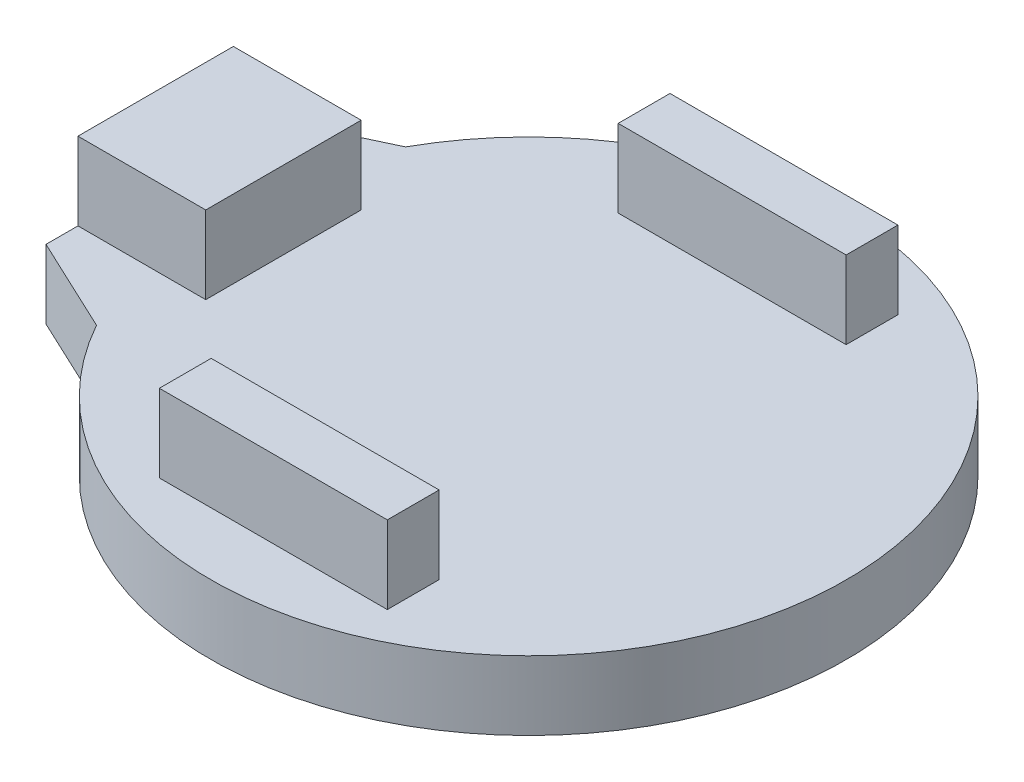
ISO-10303-21;
HEADER;
FILE_DESCRIPTION(('STEP AP214'),'2;1');
FILE_NAME('part.step','',(''),(''),'','','');
FILE_SCHEMA(('AUTOMOTIVE_DESIGN { 1 0 10303 214 1 1 1 1 }'));
ENDSEC;
DATA;
#1=APPLICATION_CONTEXT('core data for automotive mechanical design processes');
#2=APPLICATION_PROTOCOL_DEFINITION('international standard','automotive_design',2000,#1);
#3=PRODUCT_CONTEXT('',#1,'mechanical');
#4=PRODUCT('Part','Part','',(#3));
#5=PRODUCT_RELATED_PRODUCT_CATEGORY('part','',(#4));
#6=PRODUCT_DEFINITION_FORMATION('','',#4);
#7=PRODUCT_DEFINITION_CONTEXT('part definition',#1,'design');
#8=PRODUCT_DEFINITION('design','',#6,#7);
#9=PRODUCT_DEFINITION_SHAPE('','',#8);
#10=(LENGTH_UNIT() NAMED_UNIT(*) SI_UNIT(.MILLI.,.METRE.));
#11=(NAMED_UNIT(*) PLANE_ANGLE_UNIT() SI_UNIT($,.RADIAN.));
#12=(NAMED_UNIT(*) SI_UNIT($,.STERADIAN.) SOLID_ANGLE_UNIT());
#13=UNCERTAINTY_MEASURE_WITH_UNIT(LENGTH_MEASURE(1.E-05),#10,'distance_accuracy_value','');
#14=(GEOMETRIC_REPRESENTATION_CONTEXT(3) GLOBAL_UNCERTAINTY_ASSIGNED_CONTEXT((#13)) GLOBAL_UNIT_ASSIGNED_CONTEXT((#10,
#11,#12)) REPRESENTATION_CONTEXT('',''));
#15=CARTESIAN_POINT('',(0.,0.,0.));
#16=DIRECTION('',(0.,0.,1.));
#17=DIRECTION('',(1.,0.,0.));
#18=AXIS2_PLACEMENT_3D('',#15,#16,#17);
#19=CARTESIAN_POINT('',(0.,4.,0.));
#20=DIRECTION('',(0.,1.,0.));
#21=DIRECTION('',(0.,0.,1.));
#22=AXIS2_PLACEMENT_3D('',#19,#20,#21);
#23=PLANE('',#22);
#24=DIRECTION('',(-1.,0.,0.));
#25=VECTOR('',#24,1.);
#26=CARTESIAN_POINT('',(-6.6,4.,-14.785));
#27=LINE('',#26,#25);
#28=CARTESIAN_POINT('',(6.6,4.,-14.785));
#29=VERTEX_POINT('',#28);
#30=CARTESIAN_POINT('',(-6.6,4.,-14.785));
#31=VERTEX_POINT('',#30);
#32=EDGE_CURVE('E215',#29,#31,#27,.T.);
#33=ORIENTED_EDGE('',*,*,#32,.F.);
#34=DIRECTION('',(0.,0.,-1.));
#35=VECTOR('',#34,1.);
#36=CARTESIAN_POINT('',(6.6,4.,-14.785));
#37=LINE('',#36,#35);
#38=CARTESIAN_POINT('',(6.6,4.,-11.785));
#39=VERTEX_POINT('',#38);
#40=EDGE_CURVE('E201',#39,#29,#37,.T.);
#41=ORIENTED_EDGE('',*,*,#40,.F.);
#42=DIRECTION('',(1.,0.,0.));
#43=VECTOR('',#42,1.);
#44=CARTESIAN_POINT('',(-6.6,4.,-11.785));
#45=LINE('',#44,#43);
#46=CARTESIAN_POINT('',(-6.6,4.,-11.785));
#47=VERTEX_POINT('',#46);
#48=EDGE_CURVE('E206',#47,#39,#45,.T.);
#49=ORIENTED_EDGE('',*,*,#48,.F.);
#50=DIRECTION('',(0.,0.,1.));
#51=VECTOR('',#50,1.);
#52=CARTESIAN_POINT('',(-6.6,4.,-14.785));
#53=LINE('',#52,#51);
#54=EDGE_CURVE('E217',#31,#47,#53,.T.);
#55=ORIENTED_EDGE('',*,*,#54,.F.);
#56=EDGE_LOOP('',(#33,#41,#49,#55));
#57=FACE_BOUND('',#56,.T.);
#58=DIRECTION('',(-1.,0.,0.));
#59=VECTOR('',#58,1.);
#60=CARTESIAN_POINT('',(-6.6,4.,11.785));
#61=LINE('',#60,#59);
#62=CARTESIAN_POINT('',(6.6,4.,11.785));
#63=VERTEX_POINT('',#62);
#64=CARTESIAN_POINT('',(-6.6,4.,11.785));
#65=VERTEX_POINT('',#64);
#66=EDGE_CURVE('E170',#63,#65,#61,.T.);
#67=ORIENTED_EDGE('',*,*,#66,.F.);
#68=DIRECTION('',(0.,0.,-1.));
#69=VECTOR('',#68,1.);
#70=CARTESIAN_POINT('',(6.6,4.,11.785));
#71=LINE('',#70,#69);
#72=CARTESIAN_POINT('',(6.6,4.,14.785));
#73=VERTEX_POINT('',#72);
#74=EDGE_CURVE('E167',#73,#63,#71,.T.);
#75=ORIENTED_EDGE('',*,*,#74,.F.);
#76=DIRECTION('',(1.,0.,0.));
#77=VECTOR('',#76,1.);
#78=CARTESIAN_POINT('',(-6.6,4.,14.785));
#79=LINE('',#78,#77);
#80=CARTESIAN_POINT('',(-6.6,4.,14.785));
#81=VERTEX_POINT('',#80);
#82=EDGE_CURVE('E180',#81,#73,#79,.T.);
#83=ORIENTED_EDGE('',*,*,#82,.F.);
#84=DIRECTION('',(0.,0.,1.));
#85=VECTOR('',#84,1.);
#86=CARTESIAN_POINT('',(-6.6,4.,11.785));
#87=LINE('',#86,#85);
#88=EDGE_CURVE('E188',#65,#81,#87,.T.);
#89=ORIENTED_EDGE('',*,*,#88,.F.);
#90=EDGE_LOOP('',(#67,#75,#83,#89));
#91=FACE_BOUND('',#90,.T.);
#92=DIRECTION('',(0.,0.,1.));
#93=VECTOR('',#92,1.);
#94=CARTESIAN_POINT('',(-21.6,4.,6.35));
#95=LINE('',#94,#93);
#96=CARTESIAN_POINT('',(-21.6,4.,-6.35));
#97=VERTEX_POINT('',#96);
#98=CARTESIAN_POINT('',(-21.6,4.,-4.5));
#99=VERTEX_POINT('',#98);
#100=EDGE_CURVE('E236',#97,#99,#95,.T.);
#101=ORIENTED_EDGE('',*,*,#100,.T.);
#102=DIRECTION('',(-1.,0.,0.));
#103=VECTOR('',#102,1.);
#104=CARTESIAN_POINT('',(-21.6,4.,-4.5));
#105=LINE('',#104,#103);
#106=CARTESIAN_POINT('',(-14.2,4.,-4.5));
#107=VERTEX_POINT('',#106);
#108=EDGE_CURVE('E48',#107,#99,#105,.T.);
#109=ORIENTED_EDGE('',*,*,#108,.F.);
#110=DIRECTION('',(0.,0.,-1.));
#111=VECTOR('',#110,1.);
#112=CARTESIAN_POINT('',(-14.2,4.,4.5));
#113=LINE('',#112,#111);
#114=CARTESIAN_POINT('',(-14.2,4.,4.5));
#115=VERTEX_POINT('',#114);
#116=EDGE_CURVE('E53',#115,#107,#113,.T.);
#117=ORIENTED_EDGE('',*,*,#116,.F.);
#118=DIRECTION('',(1.,0.,0.));
#119=VECTOR('',#118,1.);
#120=CARTESIAN_POINT('',(-21.6,4.,4.5));
#121=LINE('',#120,#119);
#122=CARTESIAN_POINT('',(-21.6,4.,4.5));
#123=VERTEX_POINT('',#122);
#124=EDGE_CURVE('E164',#123,#115,#121,.T.);
#125=ORIENTED_EDGE('',*,*,#124,.F.);
#126=CARTESIAN_POINT('',(-21.6,4.,6.35));
#127=VERTEX_POINT('',#126);
#128=EDGE_CURVE('E234',#123,#127,#95,.T.);
#129=ORIENTED_EDGE('',*,*,#128,.T.);
#130=DIRECTION('',(0.905008250584876,0.,0.425394013090572));
#131=VECTOR('',#130,1.);
#132=CARTESIAN_POINT('',(-21.6,4.,6.35));
#133=LINE('',#132,#131);
#134=CARTESIAN_POINT('',(-16.0794496714323,4.,8.94490347985249));
#135=VERTEX_POINT('',#134);
#136=EDGE_CURVE('E238',#127,#135,#133,.T.);
#137=ORIENTED_EDGE('',*,*,#136,.T.);
#138=CARTESIAN_POINT('',(0.,4.,0.));
#139=DIRECTION('',(0.,1.,0.));
#140=DIRECTION('',(0.,0.,1.));
#141=AXIS2_PLACEMENT_3D('',#138,#139,#140);
#142=CIRCLE('',#141,18.4);
#143=CARTESIAN_POINT('',(-16.0794496714323,4.,-8.94490347985249));
#144=VERTEX_POINT('',#143);
#145=EDGE_CURVE('E240',#135,#144,#142,.T.);
#146=ORIENTED_EDGE('',*,*,#145,.T.);
#147=DIRECTION('',(-0.905008250584876,0.,0.425394013090572));
#148=VECTOR('',#147,1.);
#149=CARTESIAN_POINT('',(-21.6,4.,-6.35));
#150=LINE('',#149,#148);
#151=EDGE_CURVE('E231',#144,#97,#150,.T.);
#152=ORIENTED_EDGE('',*,*,#151,.T.);
#153=EDGE_LOOP('',(#101,#109,#117,#125,#129,#137,#146,#152));
#154=FACE_BOUND('',#153,.T.);
#155=ADVANCED_FACE('F33',(#57,#91,#154),#23,.T.);
#156=CARTESIAN_POINT('',(-21.6,4.,-6.35));
#157=DIRECTION('',(0.425394013090572,0.,0.905008250584876));
#158=DIRECTION('',(0.905008250584876,0.,-0.425394013090572));
#159=AXIS2_PLACEMENT_3D('',#156,#157,#158);
#160=PLANE('',#159);
#161=DIRECTION('',(-0.905008250584876,0.,0.425394013090572));
#162=VECTOR('',#161,1.);
#163=CARTESIAN_POINT('',(-21.6,0.,-6.35));
#164=LINE('',#163,#162);
#165=CARTESIAN_POINT('',(-16.0794496714323,0.,-8.94490347985249));
#166=VERTEX_POINT('',#165);
#167=CARTESIAN_POINT('',(-21.6,0.,-6.35));
#168=VERTEX_POINT('',#167);
#169=EDGE_CURVE('E230',#166,#168,#164,.T.);
#170=ORIENTED_EDGE('',*,*,#169,.T.);
#171=DIRECTION('',(0.,-1.,0.));
#172=VECTOR('',#171,1.);
#173=CARTESIAN_POINT('',(-21.6,4.,-6.35));
#174=LINE('',#173,#172);
#175=EDGE_CURVE('E11',#97,#168,#174,.T.);
#176=ORIENTED_EDGE('',*,*,#175,.F.);
#177=ORIENTED_EDGE('',*,*,#151,.F.);
#178=DIRECTION('',(0.,-1.,0.));
#179=VECTOR('',#178,1.);
#180=CARTESIAN_POINT('',(-16.0794496714323,4.,-8.94490347985249));
#181=LINE('',#180,#179);
#182=EDGE_CURVE('E242',#144,#166,#181,.T.);
#183=ORIENTED_EDGE('',*,*,#182,.T.);
#184=EDGE_LOOP('',(#170,#176,#177,#183));
#185=FACE_BOUND('',#184,.T.);
#186=ADVANCED_FACE('F35',(#185),#160,.F.);
#187=CARTESIAN_POINT('',(-21.6,4.,6.35));
#188=DIRECTION('',(1.,0.,0.));
#189=DIRECTION('',(0.,0.,-1.));
#190=AXIS2_PLACEMENT_3D('',#187,#188,#189);
#191=PLANE('',#190);
#192=DIRECTION('',(0.,0.,1.));
#193=VECTOR('',#192,1.);
#194=CARTESIAN_POINT('',(-21.6,0.,6.35));
#195=LINE('',#194,#193);
#196=CARTESIAN_POINT('',(-21.6,0.,6.35));
#197=VERTEX_POINT('',#196);
#198=EDGE_CURVE('E245',#168,#197,#195,.T.);
#199=ORIENTED_EDGE('',*,*,#198,.T.);
#200=DIRECTION('',(0.,-1.,0.));
#201=VECTOR('',#200,1.);
#202=CARTESIAN_POINT('',(-21.6,4.,6.35));
#203=LINE('',#202,#201);
#204=EDGE_CURVE('E41',#127,#197,#203,.T.);
#205=ORIENTED_EDGE('',*,*,#204,.F.);
#206=ORIENTED_EDGE('',*,*,#128,.F.);
#207=DIRECTION('',(0.,-1.,0.));
#208=VECTOR('',#207,1.);
#209=CARTESIAN_POINT('',(-21.6,8.5,4.5));
#210=LINE('',#209,#208);
#211=CARTESIAN_POINT('',(-21.6,8.5,4.5));
#212=VERTEX_POINT('',#211);
#213=EDGE_CURVE('E172',#212,#123,#210,.T.);
#214=ORIENTED_EDGE('',*,*,#213,.F.);
#215=DIRECTION('',(0.,0.,1.));
#216=VECTOR('',#215,1.);
#217=CARTESIAN_POINT('',(-21.6,8.5,4.5));
#218=LINE('',#217,#216);
#219=CARTESIAN_POINT('',(-21.6,8.5,-4.5));
#220=VERTEX_POINT('',#219);
#221=EDGE_CURVE('E154',#220,#212,#218,.T.);
#222=ORIENTED_EDGE('',*,*,#221,.F.);
#223=DIRECTION('',(0.,-1.,0.));
#224=VECTOR('',#223,1.);
#225=CARTESIAN_POINT('',(-21.6,8.5,-4.5));
#226=LINE('',#225,#224);
#227=EDGE_CURVE('E151',#220,#99,#226,.T.);
#228=ORIENTED_EDGE('',*,*,#227,.T.);
#229=ORIENTED_EDGE('',*,*,#100,.F.);
#230=ORIENTED_EDGE('',*,*,#175,.T.);
#231=EDGE_LOOP('',(#199,#205,#206,#214,#222,#228,#229,#230));
#232=FACE_BOUND('',#231,.T.);
#233=ADVANCED_FACE('F275',(#232),#191,.F.);
#234=CARTESIAN_POINT('',(-21.6,4.,6.35));
#235=DIRECTION('',(0.425394013090572,0.,-0.905008250584877));
#236=DIRECTION('',(-0.905008250584877,0.,-0.425394013090572));
#237=AXIS2_PLACEMENT_3D('',#234,#235,#236);
#238=PLANE('',#237);
#239=DIRECTION('',(0.905008250584876,0.,0.425394013090572));
#240=VECTOR('',#239,1.);
#241=CARTESIAN_POINT('',(-21.6,0.,6.35));
#242=LINE('',#241,#240);
#243=CARTESIAN_POINT('',(-16.0794496714323,0.,8.94490347985249));
#244=VERTEX_POINT('',#243);
#245=EDGE_CURVE('E247',#197,#244,#242,.T.);
#246=ORIENTED_EDGE('',*,*,#245,.T.);
#247=DIRECTION('',(0.,-1.,0.));
#248=VECTOR('',#247,1.);
#249=CARTESIAN_POINT('',(-16.0794496714323,4.,8.94490347985249));
#250=LINE('',#249,#248);
#251=EDGE_CURVE('E252',#135,#244,#250,.T.);
#252=ORIENTED_EDGE('',*,*,#251,.F.);
#253=ORIENTED_EDGE('',*,*,#136,.F.);
#254=ORIENTED_EDGE('',*,*,#204,.T.);
#255=EDGE_LOOP('',(#246,#252,#253,#254));
#256=FACE_BOUND('',#255,.T.);
#257=ADVANCED_FACE('F259',(#256),#238,.F.);
#258=CARTESIAN_POINT('',(0.,4.,0.));
#259=DIRECTION('',(0.,-1.,0.));
#260=DIRECTION('',(0.,0.,-1.));
#261=AXIS2_PLACEMENT_3D('',#258,#259,#260);
#262=CYLINDRICAL_SURFACE('',#261,18.4);
#263=CARTESIAN_POINT('',(0.,0.,0.));
#264=DIRECTION('',(0.,1.,0.));
#265=DIRECTION('',(0.,0.,1.));
#266=AXIS2_PLACEMENT_3D('',#263,#264,#265);
#267=CIRCLE('',#266,18.4);
#268=EDGE_CURVE('E235',#244,#166,#267,.T.);
#269=ORIENTED_EDGE('',*,*,#268,.T.);
#270=ORIENTED_EDGE('',*,*,#182,.F.);
#271=ORIENTED_EDGE('',*,*,#145,.F.);
#272=ORIENTED_EDGE('',*,*,#251,.T.);
#273=EDGE_LOOP('',(#269,#270,#271,#272));
#274=FACE_BOUND('',#273,.T.);
#275=ADVANCED_FACE('F268',(#274),#262,.T.);
#276=CARTESIAN_POINT('',(0.,0.,0.));
#277=DIRECTION('',(0.,1.,0.));
#278=DIRECTION('',(0.,0.,1.));
#279=AXIS2_PLACEMENT_3D('',#276,#277,#278);
#280=PLANE('',#279);
#281=ORIENTED_EDGE('',*,*,#169,.F.);
#282=ORIENTED_EDGE('',*,*,#268,.F.);
#283=ORIENTED_EDGE('',*,*,#245,.F.);
#284=ORIENTED_EDGE('',*,*,#198,.F.);
#285=EDGE_LOOP('',(#281,#282,#283,#284));
#286=FACE_BOUND('',#285,.T.);
#287=ADVANCED_FACE('F265',(#286),#280,.F.);
#288=CARTESIAN_POINT('',(6.6,8.5,-14.785));
#289=DIRECTION('',(-1.,0.,0.));
#290=DIRECTION('',(0.,0.,1.));
#291=AXIS2_PLACEMENT_3D('',#288,#289,#290);
#292=PLANE('',#291);
#293=ORIENTED_EDGE('',*,*,#40,.T.);
#294=DIRECTION('',(0.,-1.,0.));
#295=VECTOR('',#294,1.);
#296=CARTESIAN_POINT('',(6.6,8.5,-14.785));
#297=LINE('',#296,#295);
#298=CARTESIAN_POINT('',(6.6,8.5,-14.785));
#299=VERTEX_POINT('',#298);
#300=EDGE_CURVE('E228',#299,#29,#297,.T.);
#301=ORIENTED_EDGE('',*,*,#300,.F.);
#302=DIRECTION('',(0.,0.,-1.));
#303=VECTOR('',#302,1.);
#304=CARTESIAN_POINT('',(6.6,8.5,-14.785));
#305=LINE('',#304,#303);
#306=CARTESIAN_POINT('',(6.6,8.5,-11.785));
#307=VERTEX_POINT('',#306);
#308=EDGE_CURVE('E202',#307,#299,#305,.T.);
#309=ORIENTED_EDGE('',*,*,#308,.F.);
#310=DIRECTION('',(0.,-1.,0.));
#311=VECTOR('',#310,1.);
#312=CARTESIAN_POINT('',(6.6,8.5,-11.785));
#313=LINE('',#312,#311);
#314=EDGE_CURVE('E212',#307,#39,#313,.T.);
#315=ORIENTED_EDGE('',*,*,#314,.T.);
#316=EDGE_LOOP('',(#293,#301,#309,#315));
#317=FACE_BOUND('',#316,.T.);
#318=ADVANCED_FACE('F303',(#317),#292,.F.);
#319=CARTESIAN_POINT('',(-6.6,8.5,-14.785));
#320=DIRECTION('',(0.,0.,1.));
#321=DIRECTION('',(1.,0.,0.));
#322=AXIS2_PLACEMENT_3D('',#319,#320,#321);
#323=PLANE('',#322);
#324=ORIENTED_EDGE('',*,*,#32,.T.);
#325=DIRECTION('',(0.,-1.,0.));
#326=VECTOR('',#325,1.);
#327=CARTESIAN_POINT('',(-6.6,8.5,-14.785));
#328=LINE('',#327,#326);
#329=CARTESIAN_POINT('',(-6.6,8.5,-14.785));
#330=VERTEX_POINT('',#329);
#331=EDGE_CURVE('E225',#330,#31,#328,.T.);
#332=ORIENTED_EDGE('',*,*,#331,.F.);
#333=DIRECTION('',(-1.,0.,0.));
#334=VECTOR('',#333,1.);
#335=CARTESIAN_POINT('',(-6.6,8.5,-14.785));
#336=LINE('',#335,#334);
#337=EDGE_CURVE('E205',#299,#330,#336,.T.);
#338=ORIENTED_EDGE('',*,*,#337,.F.);
#339=ORIENTED_EDGE('',*,*,#300,.T.);
#340=EDGE_LOOP('',(#324,#332,#338,#339));
#341=FACE_BOUND('',#340,.T.);
#342=ADVANCED_FACE('F333',(#341),#323,.F.);
#343=CARTESIAN_POINT('',(-6.6,8.5,-14.785));
#344=DIRECTION('',(1.,0.,0.));
#345=DIRECTION('',(0.,0.,-1.));
#346=AXIS2_PLACEMENT_3D('',#343,#344,#345);
#347=PLANE('',#346);
#348=ORIENTED_EDGE('',*,*,#54,.T.);
#349=DIRECTION('',(0.,-1.,0.));
#350=VECTOR('',#349,1.);
#351=CARTESIAN_POINT('',(-6.6,8.5,-11.785));
#352=LINE('',#351,#350);
#353=CARTESIAN_POINT('',(-6.6,8.5,-11.785));
#354=VERTEX_POINT('',#353);
#355=EDGE_CURVE('E223',#354,#47,#352,.T.);
#356=ORIENTED_EDGE('',*,*,#355,.F.);
#357=DIRECTION('',(0.,0.,1.));
#358=VECTOR('',#357,1.);
#359=CARTESIAN_POINT('',(-6.6,8.5,-14.785));
#360=LINE('',#359,#358);
#361=EDGE_CURVE('E208',#330,#354,#360,.T.);
#362=ORIENTED_EDGE('',*,*,#361,.F.);
#363=ORIENTED_EDGE('',*,*,#331,.T.);
#364=EDGE_LOOP('',(#348,#356,#362,#363));
#365=FACE_BOUND('',#364,.T.);
#366=ADVANCED_FACE('F340',(#365),#347,.F.);
#367=CARTESIAN_POINT('',(-6.6,8.5,-11.785));
#368=DIRECTION('',(0.,0.,-1.));
#369=DIRECTION('',(-1.,0.,0.));
#370=AXIS2_PLACEMENT_3D('',#367,#368,#369);
#371=PLANE('',#370);
#372=ORIENTED_EDGE('',*,*,#48,.T.);
#373=ORIENTED_EDGE('',*,*,#314,.F.);
#374=DIRECTION('',(1.,0.,0.));
#375=VECTOR('',#374,1.);
#376=CARTESIAN_POINT('',(-6.6,8.5,-11.785));
#377=LINE('',#376,#375);
#378=EDGE_CURVE('E210',#354,#307,#377,.T.);
#379=ORIENTED_EDGE('',*,*,#378,.F.);
#380=ORIENTED_EDGE('',*,*,#355,.T.);
#381=EDGE_LOOP('',(#372,#373,#379,#380));
#382=FACE_BOUND('',#381,.T.);
#383=ADVANCED_FACE('F347',(#382),#371,.F.);
#384=CARTESIAN_POINT('',(0.,8.5,0.));
#385=DIRECTION('',(0.,1.,0.));
#386=DIRECTION('',(0.,0.,1.));
#387=AXIS2_PLACEMENT_3D('',#384,#385,#386);
#388=PLANE('',#387);
#389=ORIENTED_EDGE('',*,*,#308,.T.);
#390=ORIENTED_EDGE('',*,*,#337,.T.);
#391=ORIENTED_EDGE('',*,*,#361,.T.);
#392=ORIENTED_EDGE('',*,*,#378,.T.);
#393=EDGE_LOOP('',(#389,#390,#391,#392));
#394=FACE_BOUND('',#393,.T.);
#395=ADVANCED_FACE('F355',(#394),#388,.T.);
#396=CARTESIAN_POINT('',(6.6,8.5,11.785));
#397=DIRECTION('',(-1.,0.,0.));
#398=DIRECTION('',(0.,0.,1.));
#399=AXIS2_PLACEMENT_3D('',#396,#397,#398);
#400=PLANE('',#399);
#401=ORIENTED_EDGE('',*,*,#74,.T.);
#402=DIRECTION('',(0.,-1.,0.));
#403=VECTOR('',#402,1.);
#404=CARTESIAN_POINT('',(6.6,8.5,11.785));
#405=LINE('',#404,#403);
#406=CARTESIAN_POINT('',(6.6,8.5,11.785));
#407=VERTEX_POINT('',#406);
#408=EDGE_CURVE('E199',#407,#63,#405,.T.);
#409=ORIENTED_EDGE('',*,*,#408,.F.);
#410=DIRECTION('',(0.,0.,-1.));
#411=VECTOR('',#410,1.);
#412=CARTESIAN_POINT('',(6.6,8.5,11.785));
#413=LINE('',#412,#411);
#414=CARTESIAN_POINT('',(6.6,8.5,14.785));
#415=VERTEX_POINT('',#414);
#416=EDGE_CURVE('E176',#415,#407,#413,.T.);
#417=ORIENTED_EDGE('',*,*,#416,.F.);
#418=DIRECTION('',(0.,-1.,0.));
#419=VECTOR('',#418,1.);
#420=CARTESIAN_POINT('',(6.6,8.5,14.785));
#421=LINE('',#420,#419);
#422=EDGE_CURVE('E185',#415,#73,#421,.T.);
#423=ORIENTED_EDGE('',*,*,#422,.T.);
#424=EDGE_LOOP('',(#401,#409,#417,#423));
#425=FACE_BOUND('',#424,.T.);
#426=ADVANCED_FACE('F363',(#425),#400,.F.);
#427=CARTESIAN_POINT('',(-6.6,8.5,11.785));
#428=DIRECTION('',(0.,0.,1.));
#429=DIRECTION('',(1.,0.,0.));
#430=AXIS2_PLACEMENT_3D('',#427,#428,#429);
#431=PLANE('',#430);
#432=ORIENTED_EDGE('',*,*,#66,.T.);
#433=DIRECTION('',(0.,-1.,0.));
#434=VECTOR('',#433,1.);
#435=CARTESIAN_POINT('',(-6.6,8.5,11.785));
#436=LINE('',#435,#434);
#437=CARTESIAN_POINT('',(-6.6,8.5,11.785));
#438=VERTEX_POINT('',#437);
#439=EDGE_CURVE('E196',#438,#65,#436,.T.);
#440=ORIENTED_EDGE('',*,*,#439,.F.);
#441=DIRECTION('',(-1.,0.,0.));
#442=VECTOR('',#441,1.);
#443=CARTESIAN_POINT('',(-6.6,8.5,11.785));
#444=LINE('',#443,#442);
#445=EDGE_CURVE('E179',#407,#438,#444,.T.);
#446=ORIENTED_EDGE('',*,*,#445,.F.);
#447=ORIENTED_EDGE('',*,*,#408,.T.);
#448=EDGE_LOOP('',(#432,#440,#446,#447));
#449=FACE_BOUND('',#448,.T.);
#450=ADVANCED_FACE('F371',(#449),#431,.F.);
#451=CARTESIAN_POINT('',(-6.6,8.5,11.785));
#452=DIRECTION('',(1.,0.,0.));
#453=DIRECTION('',(0.,0.,-1.));
#454=AXIS2_PLACEMENT_3D('',#451,#452,#453);
#455=PLANE('',#454);
#456=ORIENTED_EDGE('',*,*,#88,.T.);
#457=DIRECTION('',(0.,-1.,0.));
#458=VECTOR('',#457,1.);
#459=CARTESIAN_POINT('',(-6.6,8.5,14.785));
#460=LINE('',#459,#458);
#461=CARTESIAN_POINT('',(-6.6,8.5,14.785));
#462=VERTEX_POINT('',#461);
#463=EDGE_CURVE('E194',#462,#81,#460,.T.);
#464=ORIENTED_EDGE('',*,*,#463,.F.);
#465=DIRECTION('',(0.,0.,1.));
#466=VECTOR('',#465,1.);
#467=CARTESIAN_POINT('',(-6.6,8.5,11.785));
#468=LINE('',#467,#466);
#469=EDGE_CURVE('E182',#438,#462,#468,.T.);
#470=ORIENTED_EDGE('',*,*,#469,.F.);
#471=ORIENTED_EDGE('',*,*,#439,.T.);
#472=EDGE_LOOP('',(#456,#464,#470,#471));
#473=FACE_BOUND('',#472,.T.);
#474=ADVANCED_FACE('F379',(#473),#455,.F.);
#475=CARTESIAN_POINT('',(-6.6,8.5,14.785));
#476=DIRECTION('',(0.,0.,-1.));
#477=DIRECTION('',(-1.,0.,0.));
#478=AXIS2_PLACEMENT_3D('',#475,#476,#477);
#479=PLANE('',#478);
#480=ORIENTED_EDGE('',*,*,#82,.T.);
#481=ORIENTED_EDGE('',*,*,#422,.F.);
#482=DIRECTION('',(1.,0.,0.));
#483=VECTOR('',#482,1.);
#484=CARTESIAN_POINT('',(-6.6,8.5,14.785));
#485=LINE('',#484,#483);
#486=EDGE_CURVE('E184',#462,#415,#485,.T.);
#487=ORIENTED_EDGE('',*,*,#486,.F.);
#488=ORIENTED_EDGE('',*,*,#463,.T.);
#489=EDGE_LOOP('',(#480,#481,#487,#488));
#490=FACE_BOUND('',#489,.T.);
#491=ADVANCED_FACE('F387',(#490),#479,.F.);
#492=CARTESIAN_POINT('',(0.,8.5,0.));
#493=DIRECTION('',(0.,1.,0.));
#494=DIRECTION('',(0.,0.,1.));
#495=AXIS2_PLACEMENT_3D('',#492,#493,#494);
#496=PLANE('',#495);
#497=ORIENTED_EDGE('',*,*,#416,.T.);
#498=ORIENTED_EDGE('',*,*,#445,.T.);
#499=ORIENTED_EDGE('',*,*,#469,.T.);
#500=ORIENTED_EDGE('',*,*,#486,.T.);
#501=EDGE_LOOP('',(#497,#498,#499,#500));
#502=FACE_BOUND('',#501,.T.);
#503=ADVANCED_FACE('F395',(#502),#496,.T.);
#504=CARTESIAN_POINT('',(-14.2,8.5,4.5));
#505=DIRECTION('',(-1.,0.,0.));
#506=DIRECTION('',(0.,0.,1.));
#507=AXIS2_PLACEMENT_3D('',#504,#505,#506);
#508=PLANE('',#507);
#509=ORIENTED_EDGE('',*,*,#116,.T.);
#510=DIRECTION('',(0.,-1.,0.));
#511=VECTOR('',#510,1.);
#512=CARTESIAN_POINT('',(-14.2,8.5,-4.5));
#513=LINE('',#512,#511);
#514=CARTESIAN_POINT('',(-14.2,8.5,-4.5));
#515=VERTEX_POINT('',#514);
#516=EDGE_CURVE('E149',#515,#107,#513,.T.);
#517=ORIENTED_EDGE('',*,*,#516,.F.);
#518=DIRECTION('',(0.,0.,-1.));
#519=VECTOR('',#518,1.);
#520=CARTESIAN_POINT('',(-14.2,8.5,4.5));
#521=LINE('',#520,#519);
#522=CARTESIAN_POINT('',(-14.2,8.5,4.5));
#523=VERTEX_POINT('',#522);
#524=EDGE_CURVE('E155',#523,#515,#521,.T.);
#525=ORIENTED_EDGE('',*,*,#524,.F.);
#526=DIRECTION('',(0.,-1.,0.));
#527=VECTOR('',#526,1.);
#528=CARTESIAN_POINT('',(-14.2,8.5,4.5));
#529=LINE('',#528,#527);
#530=EDGE_CURVE('E277',#523,#115,#529,.T.);
#531=ORIENTED_EDGE('',*,*,#530,.T.);
#532=EDGE_LOOP('',(#509,#517,#525,#531));
#533=FACE_BOUND('',#532,.T.);
#534=ADVANCED_FACE('F166',(#533),#508,.F.);
#535=CARTESIAN_POINT('',(-21.6,8.5,-4.5));
#536=DIRECTION('',(0.,0.,1.));
#537=DIRECTION('',(1.,0.,0.));
#538=AXIS2_PLACEMENT_3D('',#535,#536,#537);
#539=PLANE('',#538);
#540=ORIENTED_EDGE('',*,*,#108,.T.);
#541=ORIENTED_EDGE('',*,*,#227,.F.);
#542=DIRECTION('',(-1.,0.,0.));
#543=VECTOR('',#542,1.);
#544=CARTESIAN_POINT('',(-21.6,8.5,-4.5));
#545=LINE('',#544,#543);
#546=EDGE_CURVE('E145',#515,#220,#545,.T.);
#547=ORIENTED_EDGE('',*,*,#546,.F.);
#548=ORIENTED_EDGE('',*,*,#516,.T.);
#549=EDGE_LOOP('',(#540,#541,#547,#548));
#550=FACE_BOUND('',#549,.T.);
#551=ADVANCED_FACE('F147',(#550),#539,.F.);
#552=CARTESIAN_POINT('',(-21.6,8.5,4.5));
#553=DIRECTION('',(0.,0.,-1.));
#554=DIRECTION('',(-1.,0.,0.));
#555=AXIS2_PLACEMENT_3D('',#552,#553,#554);
#556=PLANE('',#555);
#557=ORIENTED_EDGE('',*,*,#124,.T.);
#558=ORIENTED_EDGE('',*,*,#530,.F.);
#559=DIRECTION('',(1.,0.,0.));
#560=VECTOR('',#559,1.);
#561=CARTESIAN_POINT('',(-21.6,8.5,4.5));
#562=LINE('',#561,#560);
#563=EDGE_CURVE('E160',#212,#523,#562,.T.);
#564=ORIENTED_EDGE('',*,*,#563,.F.);
#565=ORIENTED_EDGE('',*,*,#213,.T.);
#566=EDGE_LOOP('',(#557,#558,#564,#565));
#567=FACE_BOUND('',#566,.T.);
#568=ADVANCED_FACE('F278',(#567),#556,.F.);
#569=CARTESIAN_POINT('',(0.,8.5,0.));
#570=DIRECTION('',(0.,-1.,0.));
#571=DIRECTION('',(0.,0.,-1.));
#572=AXIS2_PLACEMENT_3D('',#569,#570,#571);
#573=PLANE('',#572);
#574=ORIENTED_EDGE('',*,*,#524,.T.);
#575=ORIENTED_EDGE('',*,*,#546,.T.);
#576=ORIENTED_EDGE('',*,*,#221,.T.);
#577=ORIENTED_EDGE('',*,*,#563,.T.);
#578=EDGE_LOOP('',(#574,#575,#576,#577));
#579=FACE_BOUND('',#578,.T.);
#580=ADVANCED_FACE('F158',(#579),#573,.F.);
#581=CLOSED_SHELL('',(#155,#186,#233,#257,#275,#287,#318,#342,#366,#383,#395,#426,#450,#474,
#491,#503,#534,#551,#568,#580));
#582=MANIFOLD_SOLID_BREP('B2',#581);
#583=ADVANCED_BREP_SHAPE_REPRESENTATION('',(#18,#582),#14);
#584=SHAPE_DEFINITION_REPRESENTATION(#9,#583);
ENDSEC;
END-ISO-10303-21;
